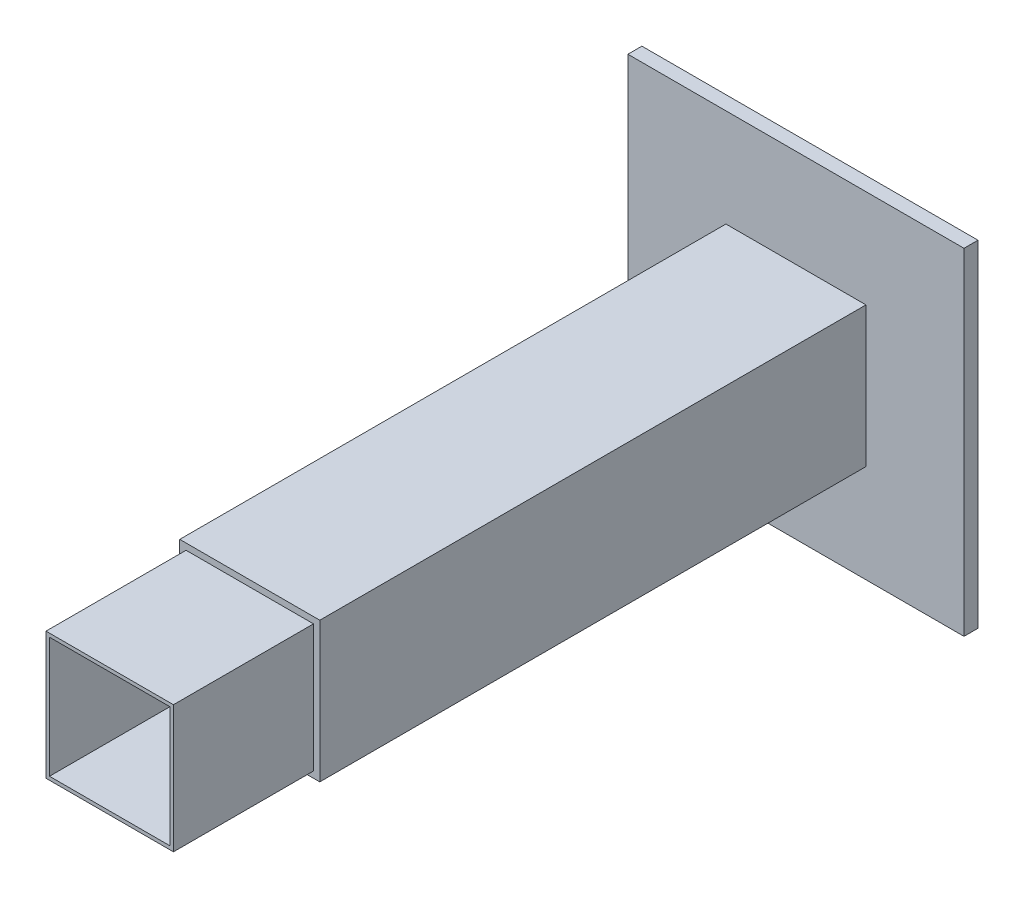
ISO-10303-21;
HEADER;
FILE_DESCRIPTION(('STEP AP214'),'2;1');
FILE_NAME('part.step','',(''),(''),'','','');
FILE_SCHEMA(('AUTOMOTIVE_DESIGN { 1 0 10303 214 1 1 1 1 }'));
ENDSEC;
DATA;
#1=APPLICATION_CONTEXT('core data for automotive mechanical design processes');
#2=APPLICATION_PROTOCOL_DEFINITION('international standard','automotive_design',2000,#1);
#3=PRODUCT_CONTEXT('',#1,'mechanical');
#4=PRODUCT('Part','Part','',(#3));
#5=PRODUCT_RELATED_PRODUCT_CATEGORY('part','',(#4));
#6=PRODUCT_DEFINITION_FORMATION('','',#4);
#7=PRODUCT_DEFINITION_CONTEXT('part definition',#1,'design');
#8=PRODUCT_DEFINITION('design','',#6,#7);
#9=PRODUCT_DEFINITION_SHAPE('','',#8);
#10=(LENGTH_UNIT() NAMED_UNIT(*) SI_UNIT(.MILLI.,.METRE.));
#11=(NAMED_UNIT(*) PLANE_ANGLE_UNIT() SI_UNIT($,.RADIAN.));
#12=(NAMED_UNIT(*) SI_UNIT($,.STERADIAN.) SOLID_ANGLE_UNIT());
#13=UNCERTAINTY_MEASURE_WITH_UNIT(LENGTH_MEASURE(1.E-05),#10,'distance_accuracy_value','');
#14=(GEOMETRIC_REPRESENTATION_CONTEXT(3) GLOBAL_UNCERTAINTY_ASSIGNED_CONTEXT((#13)) GLOBAL_UNIT_ASSIGNED_CONTEXT((#10,
#11,#12)) REPRESENTATION_CONTEXT('',''));
#15=CARTESIAN_POINT('',(0.,0.,0.));
#16=DIRECTION('',(0.,0.,1.));
#17=DIRECTION('',(1.,0.,0.));
#18=AXIS2_PLACEMENT_3D('',#15,#16,#17);
#19=CARTESIAN_POINT('',(0.,0.,250.));
#20=DIRECTION('',(0.,0.,1.));
#21=DIRECTION('',(1.,0.,0.));
#22=AXIS2_PLACEMENT_3D('',#19,#20,#21);
#23=PLANE('',#22);
#24=DIRECTION('',(-1.,0.,0.));
#25=VECTOR('',#24,1.);
#26=CARTESIAN_POINT('',(0.,-22.75,250.));
#27=LINE('',#26,#25);
#28=CARTESIAN_POINT('',(22.75,-22.75,250.));
#29=VERTEX_POINT('',#28);
#30=CARTESIAN_POINT('',(-22.75,-22.75,250.));
#31=VERTEX_POINT('',#30);
#32=EDGE_CURVE('E61',#29,#31,#27,.T.);
#33=ORIENTED_EDGE('',*,*,#32,.F.);
#34=DIRECTION('',(0.,1.,0.));
#35=VECTOR('',#34,1.);
#36=CARTESIAN_POINT('',(22.75,0.,250.));
#37=LINE('',#36,#35);
#38=CARTESIAN_POINT('',(22.75,22.75,250.));
#39=VERTEX_POINT('',#38);
#40=EDGE_CURVE('E180',#29,#39,#37,.T.);
#41=ORIENTED_EDGE('',*,*,#40,.T.);
#42=DIRECTION('',(-1.,0.,0.));
#43=VECTOR('',#42,1.);
#44=CARTESIAN_POINT('',(0.,22.75,250.));
#45=LINE('',#44,#43);
#46=CARTESIAN_POINT('',(-22.75,22.75,250.));
#47=VERTEX_POINT('',#46);
#48=EDGE_CURVE('E184',#39,#47,#45,.T.);
#49=ORIENTED_EDGE('',*,*,#48,.T.);
#50=DIRECTION('',(0.,1.,0.));
#51=VECTOR('',#50,1.);
#52=CARTESIAN_POINT('',(-22.75,0.,250.));
#53=LINE('',#52,#51);
#54=EDGE_CURVE('E200',#31,#47,#53,.T.);
#55=ORIENTED_EDGE('',*,*,#54,.F.);
#56=EDGE_LOOP('',(#33,#41,#49,#55));
#57=FACE_BOUND('',#56,.T.);
#58=DIRECTION('',(-1.,0.,0.));
#59=VECTOR('',#58,1.);
#60=CARTESIAN_POINT('',(21.5,-21.5,250.));
#61=LINE('',#60,#59);
#62=CARTESIAN_POINT('',(21.5,-21.5,250.));
#63=VERTEX_POINT('',#62);
#64=CARTESIAN_POINT('',(-21.5,-21.5,250.));
#65=VERTEX_POINT('',#64);
#66=EDGE_CURVE('E233',#63,#65,#61,.T.);
#67=ORIENTED_EDGE('',*,*,#66,.T.);
#68=DIRECTION('',(0.,1.,0.));
#69=VECTOR('',#68,1.);
#70=CARTESIAN_POINT('',(-21.5,-21.5,250.));
#71=LINE('',#70,#69);
#72=CARTESIAN_POINT('',(-21.5,21.5,250.));
#73=VERTEX_POINT('',#72);
#74=EDGE_CURVE('E229',#65,#73,#71,.T.);
#75=ORIENTED_EDGE('',*,*,#74,.T.);
#76=DIRECTION('',(-1.,0.,0.));
#77=VECTOR('',#76,1.);
#78=CARTESIAN_POINT('',(21.5,21.5,250.));
#79=LINE('',#78,#77);
#80=CARTESIAN_POINT('',(21.5,21.5,250.));
#81=VERTEX_POINT('',#80);
#82=EDGE_CURVE('E213',#81,#73,#79,.T.);
#83=ORIENTED_EDGE('',*,*,#82,.F.);
#84=DIRECTION('',(0.,1.,0.));
#85=VECTOR('',#84,1.);
#86=CARTESIAN_POINT('',(21.5,-21.5,250.));
#87=LINE('',#86,#85);
#88=EDGE_CURVE('E237',#63,#81,#87,.T.);
#89=ORIENTED_EDGE('',*,*,#88,.F.);
#90=EDGE_LOOP('',(#67,#75,#83,#89));
#91=FACE_BOUND('',#90,.T.);
#92=ADVANCED_FACE('F45',(#57,#91),#23,.T.);
#93=CARTESIAN_POINT('',(25.,25.,250.));
#94=DIRECTION('',(-1.,0.,0.));
#95=DIRECTION('',(0.,-1.,0.));
#96=AXIS2_PLACEMENT_3D('',#93,#94,#95);
#97=PLANE('',#96);
#98=DIRECTION('',(0.,1.,0.));
#99=VECTOR('',#98,1.);
#100=CARTESIAN_POINT('',(25.,-25.,200.));
#101=LINE('',#100,#99);
#102=CARTESIAN_POINT('',(25.,-25.,200.));
#103=VERTEX_POINT('',#102);
#104=CARTESIAN_POINT('',(25.,25.,200.));
#105=VERTEX_POINT('',#104);
#106=EDGE_CURVE('E202',#103,#105,#101,.T.);
#107=ORIENTED_EDGE('',*,*,#106,.F.);
#108=DIRECTION('',(0.,0.,-1.));
#109=VECTOR('',#108,1.);
#110=CARTESIAN_POINT('',(25.,-25.,250.));
#111=LINE('',#110,#109);
#112=CARTESIAN_POINT('',(25.,-25.,5.));
#113=VERTEX_POINT('',#112);
#114=EDGE_CURVE('E271',#103,#113,#111,.T.);
#115=ORIENTED_EDGE('',*,*,#114,.T.);
#116=DIRECTION('',(0.,1.,0.));
#117=VECTOR('',#116,1.);
#118=CARTESIAN_POINT('',(25.,25.,5.));
#119=LINE('',#118,#117);
#120=CARTESIAN_POINT('',(25.,25.,5.));
#121=VERTEX_POINT('',#120);
#122=EDGE_CURVE('E225',#113,#121,#119,.T.);
#123=ORIENTED_EDGE('',*,*,#122,.T.);
#124=DIRECTION('',(0.,0.,-1.));
#125=VECTOR('',#124,1.);
#126=CARTESIAN_POINT('',(25.,25.,250.));
#127=LINE('',#126,#125);
#128=EDGE_CURVE('E280',#105,#121,#127,.T.);
#129=ORIENTED_EDGE('',*,*,#128,.F.);
#130=EDGE_LOOP('',(#107,#115,#123,#129));
#131=FACE_BOUND('',#130,.T.);
#132=ADVANCED_FACE('F347',(#131),#97,.F.);
#133=CARTESIAN_POINT('',(-25.,25.,250.));
#134=DIRECTION('',(0.,-1.,0.));
#135=DIRECTION('',(0.,0.,-1.));
#136=AXIS2_PLACEMENT_3D('',#133,#134,#135);
#137=PLANE('',#136);
#138=DIRECTION('',(-1.,0.,0.));
#139=VECTOR('',#138,1.);
#140=CARTESIAN_POINT('',(25.,25.,200.));
#141=LINE('',#140,#139);
#142=CARTESIAN_POINT('',(-25.,25.,200.));
#143=VERTEX_POINT('',#142);
#144=EDGE_CURVE('E205',#105,#143,#141,.T.);
#145=ORIENTED_EDGE('',*,*,#144,.F.);
#146=ORIENTED_EDGE('',*,*,#128,.T.);
#147=DIRECTION('',(-1.,0.,0.));
#148=VECTOR('',#147,1.);
#149=CARTESIAN_POINT('',(-25.,25.,5.));
#150=LINE('',#149,#148);
#151=CARTESIAN_POINT('',(-25.,25.,5.));
#152=VERTEX_POINT('',#151);
#153=EDGE_CURVE('E259',#121,#152,#150,.T.);
#154=ORIENTED_EDGE('',*,*,#153,.T.);
#155=DIRECTION('',(0.,0.,-1.));
#156=VECTOR('',#155,1.);
#157=CARTESIAN_POINT('',(-25.,25.,250.));
#158=LINE('',#157,#156);
#159=EDGE_CURVE('E277',#143,#152,#158,.T.);
#160=ORIENTED_EDGE('',*,*,#159,.F.);
#161=EDGE_LOOP('',(#145,#146,#154,#160));
#162=FACE_BOUND('',#161,.T.);
#163=ADVANCED_FACE('F355',(#162),#137,.F.);
#164=CARTESIAN_POINT('',(-25.,25.,250.));
#165=DIRECTION('',(1.,0.,0.));
#166=DIRECTION('',(0.,1.,0.));
#167=AXIS2_PLACEMENT_3D('',#164,#165,#166);
#168=PLANE('',#167);
#169=DIRECTION('',(0.,-1.,0.));
#170=VECTOR('',#169,1.);
#171=CARTESIAN_POINT('',(-25.,25.,200.));
#172=LINE('',#171,#170);
#173=CARTESIAN_POINT('',(-25.,-25.,200.));
#174=VERTEX_POINT('',#173);
#175=EDGE_CURVE('E69',#143,#174,#172,.T.);
#176=ORIENTED_EDGE('',*,*,#175,.F.);
#177=ORIENTED_EDGE('',*,*,#159,.T.);
#178=DIRECTION('',(0.,-1.,0.));
#179=VECTOR('',#178,1.);
#180=CARTESIAN_POINT('',(-25.,25.,5.));
#181=LINE('',#180,#179);
#182=CARTESIAN_POINT('',(-25.,-25.,5.));
#183=VERTEX_POINT('',#182);
#184=EDGE_CURVE('E263',#152,#183,#181,.T.);
#185=ORIENTED_EDGE('',*,*,#184,.T.);
#186=DIRECTION('',(0.,0.,-1.));
#187=VECTOR('',#186,1.);
#188=CARTESIAN_POINT('',(-25.,-25.,250.));
#189=LINE('',#188,#187);
#190=EDGE_CURVE('E274',#174,#183,#189,.T.);
#191=ORIENTED_EDGE('',*,*,#190,.F.);
#192=EDGE_LOOP('',(#176,#177,#185,#191));
#193=FACE_BOUND('',#192,.T.);
#194=ADVANCED_FACE('F365',(#193),#168,.F.);
#195=CARTESIAN_POINT('',(-25.,-25.,250.));
#196=DIRECTION('',(0.,1.,0.));
#197=DIRECTION('',(0.,0.,1.));
#198=AXIS2_PLACEMENT_3D('',#195,#196,#197);
#199=PLANE('',#198);
#200=DIRECTION('',(1.,0.,0.));
#201=VECTOR('',#200,1.);
#202=CARTESIAN_POINT('',(-25.,-25.,200.));
#203=LINE('',#202,#201);
#204=EDGE_CURVE('E210',#174,#103,#203,.T.);
#205=ORIENTED_EDGE('',*,*,#204,.F.);
#206=ORIENTED_EDGE('',*,*,#190,.T.);
#207=DIRECTION('',(1.,0.,0.));
#208=VECTOR('',#207,1.);
#209=CARTESIAN_POINT('',(-25.,-25.,5.));
#210=LINE('',#209,#208);
#211=EDGE_CURVE('E267',#183,#113,#210,.T.);
#212=ORIENTED_EDGE('',*,*,#211,.T.);
#213=ORIENTED_EDGE('',*,*,#114,.F.);
#214=EDGE_LOOP('',(#205,#206,#212,#213));
#215=FACE_BOUND('',#214,.T.);
#216=ADVANCED_FACE('F363',(#215),#199,.F.);
#217=CARTESIAN_POINT('',(0.,0.,0.));
#218=DIRECTION('',(0.,0.,1.));
#219=DIRECTION('',(1.,0.,0.));
#220=AXIS2_PLACEMENT_3D('',#217,#218,#219);
#221=PLANE('',#220);
#222=DIRECTION('',(0.,-1.,0.));
#223=VECTOR('',#222,1.);
#224=CARTESIAN_POINT('',(-60.,-60.,0.));
#225=LINE('',#224,#223);
#226=CARTESIAN_POINT('',(-60.,60.,0.));
#227=VERTEX_POINT('',#226);
#228=CARTESIAN_POINT('',(-60.,-60.,0.));
#229=VERTEX_POINT('',#228);
#230=EDGE_CURVE('E283',#227,#229,#225,.T.);
#231=ORIENTED_EDGE('',*,*,#230,.F.);
#232=DIRECTION('',(-1.,0.,0.));
#233=VECTOR('',#232,1.);
#234=CARTESIAN_POINT('',(60.,60.,0.));
#235=LINE('',#234,#233);
#236=CARTESIAN_POINT('',(60.,60.,0.));
#237=VERTEX_POINT('',#236);
#238=EDGE_CURVE('E289',#237,#227,#235,.T.);
#239=ORIENTED_EDGE('',*,*,#238,.F.);
#240=DIRECTION('',(0.,1.,0.));
#241=VECTOR('',#240,1.);
#242=CARTESIAN_POINT('',(60.,-60.,0.));
#243=LINE('',#242,#241);
#244=CARTESIAN_POINT('',(60.,-60.,0.));
#245=VERTEX_POINT('',#244);
#246=EDGE_CURVE('E305',#245,#237,#243,.T.);
#247=ORIENTED_EDGE('',*,*,#246,.F.);
#248=DIRECTION('',(1.,0.,0.));
#249=VECTOR('',#248,1.);
#250=CARTESIAN_POINT('',(60.,-60.,0.));
#251=LINE('',#250,#249);
#252=EDGE_CURVE('E302',#229,#245,#251,.T.);
#253=ORIENTED_EDGE('',*,*,#252,.F.);
#254=EDGE_LOOP('',(#231,#239,#247,#253));
#255=FACE_BOUND('',#254,.T.);
#256=DIRECTION('',(0.,-1.,0.));
#257=VECTOR('',#256,1.);
#258=CARTESIAN_POINT('',(-21.5,-21.5,0.));
#259=LINE('',#258,#257);
#260=CARTESIAN_POINT('',(-21.5,21.5,0.));
#261=VERTEX_POINT('',#260);
#262=CARTESIAN_POINT('',(-21.5,-21.5,0.));
#263=VERTEX_POINT('',#262);
#264=EDGE_CURVE('E219',#261,#263,#259,.T.);
#265=ORIENTED_EDGE('',*,*,#264,.T.);
#266=DIRECTION('',(1.,0.,0.));
#267=VECTOR('',#266,1.);
#268=CARTESIAN_POINT('',(21.5,-21.5,0.));
#269=LINE('',#268,#267);
#270=CARTESIAN_POINT('',(21.5,-21.5,0.));
#271=VERTEX_POINT('',#270);
#272=EDGE_CURVE('E214',#263,#271,#269,.T.);
#273=ORIENTED_EDGE('',*,*,#272,.T.);
#274=DIRECTION('',(0.,-1.,0.));
#275=VECTOR('',#274,1.);
#276=CARTESIAN_POINT('',(21.5,-21.5,0.));
#277=LINE('',#276,#275);
#278=CARTESIAN_POINT('',(21.5,21.5,0.));
#279=VERTEX_POINT('',#278);
#280=EDGE_CURVE('E218',#279,#271,#277,.T.);
#281=ORIENTED_EDGE('',*,*,#280,.F.);
#282=DIRECTION('',(1.,0.,0.));
#283=VECTOR('',#282,1.);
#284=CARTESIAN_POINT('',(21.5,21.5,0.));
#285=LINE('',#284,#283);
#286=EDGE_CURVE('E222',#261,#279,#285,.T.);
#287=ORIENTED_EDGE('',*,*,#286,.F.);
#288=EDGE_LOOP('',(#265,#273,#281,#287));
#289=FACE_BOUND('',#288,.T.);
#290=ADVANCED_FACE('F328',(#255,#289),#221,.F.);
#291=CARTESIAN_POINT('',(-60.,-60.,5.));
#292=DIRECTION('',(1.,0.,0.));
#293=DIRECTION('',(0.,0.,-1.));
#294=AXIS2_PLACEMENT_3D('',#291,#292,#293);
#295=PLANE('',#294);
#296=ORIENTED_EDGE('',*,*,#230,.T.);
#297=DIRECTION('',(0.,0.,-1.));
#298=VECTOR('',#297,1.);
#299=CARTESIAN_POINT('',(-60.,-60.,5.));
#300=LINE('',#299,#298);
#301=CARTESIAN_POINT('',(-60.,-60.,5.));
#302=VERTEX_POINT('',#301);
#303=EDGE_CURVE('E11',#302,#229,#300,.T.);
#304=ORIENTED_EDGE('',*,*,#303,.F.);
#305=DIRECTION('',(0.,-1.,0.));
#306=VECTOR('',#305,1.);
#307=CARTESIAN_POINT('',(-60.,-60.,5.));
#308=LINE('',#307,#306);
#309=CARTESIAN_POINT('',(-60.,60.,5.));
#310=VERTEX_POINT('',#309);
#311=EDGE_CURVE('E284',#310,#302,#308,.T.);
#312=ORIENTED_EDGE('',*,*,#311,.F.);
#313=DIRECTION('',(0.,0.,-1.));
#314=VECTOR('',#313,1.);
#315=CARTESIAN_POINT('',(-60.,60.,5.));
#316=LINE('',#315,#314);
#317=EDGE_CURVE('E298',#310,#227,#316,.T.);
#318=ORIENTED_EDGE('',*,*,#317,.T.);
#319=EDGE_LOOP('',(#296,#304,#312,#318));
#320=FACE_BOUND('',#319,.T.);
#321=ADVANCED_FACE('F47',(#320),#295,.F.);
#322=CARTESIAN_POINT('',(60.,-60.,5.));
#323=DIRECTION('',(0.,1.,0.));
#324=DIRECTION('',(-1.,0.,0.));
#325=AXIS2_PLACEMENT_3D('',#322,#323,#324);
#326=PLANE('',#325);
#327=ORIENTED_EDGE('',*,*,#252,.T.);
#328=DIRECTION('',(0.,0.,-1.));
#329=VECTOR('',#328,1.);
#330=CARTESIAN_POINT('',(60.,-60.,5.));
#331=LINE('',#330,#329);
#332=CARTESIAN_POINT('',(60.,-60.,5.));
#333=VERTEX_POINT('',#332);
#334=EDGE_CURVE('E54',#333,#245,#331,.T.);
#335=ORIENTED_EDGE('',*,*,#334,.F.);
#336=DIRECTION('',(1.,0.,0.));
#337=VECTOR('',#336,1.);
#338=CARTESIAN_POINT('',(60.,-60.,5.));
#339=LINE('',#338,#337);
#340=EDGE_CURVE('E288',#302,#333,#339,.T.);
#341=ORIENTED_EDGE('',*,*,#340,.F.);
#342=ORIENTED_EDGE('',*,*,#303,.T.);
#343=EDGE_LOOP('',(#327,#335,#341,#342));
#344=FACE_BOUND('',#343,.T.);
#345=ADVANCED_FACE('F339',(#344),#326,.F.);
#346=CARTESIAN_POINT('',(60.,-60.,5.));
#347=DIRECTION('',(-1.,0.,0.));
#348=DIRECTION('',(0.,0.,1.));
#349=AXIS2_PLACEMENT_3D('',#346,#347,#348);
#350=PLANE('',#349);
#351=ORIENTED_EDGE('',*,*,#246,.T.);
#352=DIRECTION('',(0.,0.,-1.));
#353=VECTOR('',#352,1.);
#354=CARTESIAN_POINT('',(60.,60.,5.));
#355=LINE('',#354,#353);
#356=CARTESIAN_POINT('',(60.,60.,5.));
#357=VERTEX_POINT('',#356);
#358=EDGE_CURVE('E313',#357,#237,#355,.T.);
#359=ORIENTED_EDGE('',*,*,#358,.F.);
#360=DIRECTION('',(0.,1.,0.));
#361=VECTOR('',#360,1.);
#362=CARTESIAN_POINT('',(60.,-60.,5.));
#363=LINE('',#362,#361);
#364=EDGE_CURVE('E292',#333,#357,#363,.T.);
#365=ORIENTED_EDGE('',*,*,#364,.F.);
#366=ORIENTED_EDGE('',*,*,#334,.T.);
#367=EDGE_LOOP('',(#351,#359,#365,#366));
#368=FACE_BOUND('',#367,.T.);
#369=ADVANCED_FACE('F322',(#368),#350,.F.);
#370=CARTESIAN_POINT('',(60.,60.,5.));
#371=DIRECTION('',(0.,-1.,0.));
#372=DIRECTION('',(1.,0.,0.));
#373=AXIS2_PLACEMENT_3D('',#370,#371,#372);
#374=PLANE('',#373);
#375=ORIENTED_EDGE('',*,*,#238,.T.);
#376=ORIENTED_EDGE('',*,*,#317,.F.);
#377=DIRECTION('',(-1.,0.,0.));
#378=VECTOR('',#377,1.);
#379=CARTESIAN_POINT('',(60.,60.,5.));
#380=LINE('',#379,#378);
#381=EDGE_CURVE('E295',#357,#310,#380,.T.);
#382=ORIENTED_EDGE('',*,*,#381,.F.);
#383=ORIENTED_EDGE('',*,*,#358,.T.);
#384=EDGE_LOOP('',(#375,#376,#382,#383));
#385=FACE_BOUND('',#384,.T.);
#386=ADVANCED_FACE('F332',(#385),#374,.F.);
#387=CARTESIAN_POINT('',(0.,0.,5.));
#388=DIRECTION('',(0.,0.,1.));
#389=DIRECTION('',(1.,0.,0.));
#390=AXIS2_PLACEMENT_3D('',#387,#388,#389);
#391=PLANE('',#390);
#392=ORIENTED_EDGE('',*,*,#122,.F.);
#393=ORIENTED_EDGE('',*,*,#211,.F.);
#394=ORIENTED_EDGE('',*,*,#184,.F.);
#395=ORIENTED_EDGE('',*,*,#153,.F.);
#396=EDGE_LOOP('',(#392,#393,#394,#395));
#397=FACE_BOUND('',#396,.T.);
#398=ORIENTED_EDGE('',*,*,#311,.T.);
#399=ORIENTED_EDGE('',*,*,#340,.T.);
#400=ORIENTED_EDGE('',*,*,#364,.T.);
#401=ORIENTED_EDGE('',*,*,#381,.T.);
#402=EDGE_LOOP('',(#398,#399,#400,#401));
#403=FACE_BOUND('',#402,.T.);
#404=ADVANCED_FACE('F338',(#397,#403),#391,.T.);
#405=CARTESIAN_POINT('',(-21.5,-21.5,-60.811183182043));
#406=DIRECTION('',(1.,0.,0.));
#407=DIRECTION('',(0.,0.,-1.));
#408=AXIS2_PLACEMENT_3D('',#405,#406,#407);
#409=PLANE('',#408);
#410=DIRECTION('',(0.,0.,1.));
#411=VECTOR('',#410,1.);
#412=CARTESIAN_POINT('',(-21.5,21.5,-60.811183182043));
#413=LINE('',#412,#411);
#414=EDGE_CURVE('E240',#261,#73,#413,.T.);
#415=ORIENTED_EDGE('',*,*,#414,.T.);
#416=ORIENTED_EDGE('',*,*,#74,.F.);
#417=DIRECTION('',(0.,0.,1.));
#418=VECTOR('',#417,1.);
#419=CARTESIAN_POINT('',(-21.5,-21.5,-60.811183182043));
#420=LINE('',#419,#418);
#421=EDGE_CURVE('E248',#263,#65,#420,.T.);
#422=ORIENTED_EDGE('',*,*,#421,.F.);
#423=ORIENTED_EDGE('',*,*,#264,.F.);
#424=EDGE_LOOP('',(#415,#416,#422,#423));
#425=FACE_BOUND('',#424,.T.);
#426=ADVANCED_FACE('F375',(#425),#409,.T.);
#427=CARTESIAN_POINT('',(21.5,-21.5,-60.811183182043));
#428=DIRECTION('',(0.,1.,0.));
#429=DIRECTION('',(0.,0.,1.));
#430=AXIS2_PLACEMENT_3D('',#427,#428,#429);
#431=PLANE('',#430);
#432=ORIENTED_EDGE('',*,*,#421,.T.);
#433=ORIENTED_EDGE('',*,*,#66,.F.);
#434=DIRECTION('',(0.,0.,1.));
#435=VECTOR('',#434,1.);
#436=CARTESIAN_POINT('',(21.5,-21.5,-60.811183182043));
#437=LINE('',#436,#435);
#438=EDGE_CURVE('E245',#271,#63,#437,.T.);
#439=ORIENTED_EDGE('',*,*,#438,.F.);
#440=ORIENTED_EDGE('',*,*,#272,.F.);
#441=EDGE_LOOP('',(#432,#433,#439,#440));
#442=FACE_BOUND('',#441,.T.);
#443=ADVANCED_FACE('F401',(#442),#431,.T.);
#444=CARTESIAN_POINT('',(21.5,-21.5,-60.811183182043));
#445=DIRECTION('',(1.,0.,0.));
#446=DIRECTION('',(0.,0.,-1.));
#447=AXIS2_PLACEMENT_3D('',#444,#445,#446);
#448=PLANE('',#447);
#449=ORIENTED_EDGE('',*,*,#280,.T.);
#450=ORIENTED_EDGE('',*,*,#438,.T.);
#451=ORIENTED_EDGE('',*,*,#88,.T.);
#452=DIRECTION('',(0.,0.,1.));
#453=VECTOR('',#452,1.);
#454=CARTESIAN_POINT('',(21.5,21.5,-60.811183182043));
#455=LINE('',#454,#453);
#456=EDGE_CURVE('E241',#279,#81,#455,.T.);
#457=ORIENTED_EDGE('',*,*,#456,.F.);
#458=EDGE_LOOP('',(#449,#450,#451,#457));
#459=FACE_BOUND('',#458,.T.);
#460=ADVANCED_FACE('F408',(#459),#448,.F.);
#461=CARTESIAN_POINT('',(21.5,21.5,-60.811183182043));
#462=DIRECTION('',(0.,1.,0.));
#463=DIRECTION('',(0.,0.,1.));
#464=AXIS2_PLACEMENT_3D('',#461,#462,#463);
#465=PLANE('',#464);
#466=ORIENTED_EDGE('',*,*,#286,.T.);
#467=ORIENTED_EDGE('',*,*,#456,.T.);
#468=ORIENTED_EDGE('',*,*,#82,.T.);
#469=ORIENTED_EDGE('',*,*,#414,.F.);
#470=EDGE_LOOP('',(#466,#467,#468,#469));
#471=FACE_BOUND('',#470,.T.);
#472=ADVANCED_FACE('F361',(#471),#465,.F.);
#473=CARTESIAN_POINT('',(0.,0.,200.));
#474=DIRECTION('',(0.,0.,1.));
#475=DIRECTION('',(1.,0.,0.));
#476=AXIS2_PLACEMENT_3D('',#473,#474,#475);
#477=PLANE('',#476);
#478=ORIENTED_EDGE('',*,*,#106,.T.);
#479=ORIENTED_EDGE('',*,*,#144,.T.);
#480=ORIENTED_EDGE('',*,*,#175,.T.);
#481=ORIENTED_EDGE('',*,*,#204,.T.);
#482=EDGE_LOOP('',(#478,#479,#480,#481));
#483=FACE_BOUND('',#482,.T.);
#484=DIRECTION('',(1.,0.,0.));
#485=VECTOR('',#484,1.);
#486=CARTESIAN_POINT('',(0.,-22.75,200.));
#487=LINE('',#486,#485);
#488=CARTESIAN_POINT('',(-22.75,-22.75,200.));
#489=VERTEX_POINT('',#488);
#490=CARTESIAN_POINT('',(22.75,-22.75,200.));
#491=VERTEX_POINT('',#490);
#492=EDGE_CURVE('E198',#489,#491,#487,.T.);
#493=ORIENTED_EDGE('',*,*,#492,.F.);
#494=DIRECTION('',(0.,-1.,0.));
#495=VECTOR('',#494,1.);
#496=CARTESIAN_POINT('',(-22.75,0.,200.));
#497=LINE('',#496,#495);
#498=CARTESIAN_POINT('',(-22.75,22.75,200.));
#499=VERTEX_POINT('',#498);
#500=EDGE_CURVE('E176',#499,#489,#497,.T.);
#501=ORIENTED_EDGE('',*,*,#500,.F.);
#502=DIRECTION('',(1.,0.,0.));
#503=VECTOR('',#502,1.);
#504=CARTESIAN_POINT('',(0.,22.75,200.));
#505=LINE('',#504,#503);
#506=CARTESIAN_POINT('',(22.75,22.75,200.));
#507=VERTEX_POINT('',#506);
#508=EDGE_CURVE('E174',#499,#507,#505,.T.);
#509=ORIENTED_EDGE('',*,*,#508,.T.);
#510=DIRECTION('',(0.,-1.,0.));
#511=VECTOR('',#510,1.);
#512=CARTESIAN_POINT('',(22.75,0.,200.));
#513=LINE('',#512,#511);
#514=EDGE_CURVE('E160',#507,#491,#513,.T.);
#515=ORIENTED_EDGE('',*,*,#514,.T.);
#516=EDGE_LOOP('',(#493,#501,#509,#515));
#517=FACE_BOUND('',#516,.T.);
#518=ADVANCED_FACE('F175',(#483,#517),#477,.T.);
#519=CARTESIAN_POINT('',(0.,-22.75,133.531962568465));
#520=DIRECTION('',(0.,1.,0.));
#521=DIRECTION('',(-1.,0.,0.));
#522=AXIS2_PLACEMENT_3D('',#519,#520,#521);
#523=PLANE('',#522);
#524=ORIENTED_EDGE('',*,*,#492,.T.);
#525=DIRECTION('',(0.,0.,1.));
#526=VECTOR('',#525,1.);
#527=CARTESIAN_POINT('',(22.75,-22.75,133.531962568465));
#528=LINE('',#527,#526);
#529=EDGE_CURVE('E167',#491,#29,#528,.T.);
#530=ORIENTED_EDGE('',*,*,#529,.T.);
#531=ORIENTED_EDGE('',*,*,#32,.T.);
#532=DIRECTION('',(0.,0.,1.));
#533=VECTOR('',#532,1.);
#534=CARTESIAN_POINT('',(-22.75,-22.75,133.531962568465));
#535=LINE('',#534,#533);
#536=EDGE_CURVE('E171',#489,#31,#535,.T.);
#537=ORIENTED_EDGE('',*,*,#536,.F.);
#538=EDGE_LOOP('',(#524,#530,#531,#537));
#539=FACE_BOUND('',#538,.T.);
#540=ADVANCED_FACE('F465',(#539),#523,.F.);
#541=CARTESIAN_POINT('',(22.75,0.,133.531962568465));
#542=DIRECTION('',(1.,0.,0.));
#543=DIRECTION('',(0.,0.,-1.));
#544=AXIS2_PLACEMENT_3D('',#541,#542,#543);
#545=PLANE('',#544);
#546=DIRECTION('',(0.,0.,1.));
#547=VECTOR('',#546,1.);
#548=CARTESIAN_POINT('',(22.75,22.75,133.531962568465));
#549=LINE('',#548,#547);
#550=EDGE_CURVE('E165',#507,#39,#549,.T.);
#551=ORIENTED_EDGE('',*,*,#550,.T.);
#552=ORIENTED_EDGE('',*,*,#40,.F.);
#553=ORIENTED_EDGE('',*,*,#529,.F.);
#554=ORIENTED_EDGE('',*,*,#514,.F.);
#555=EDGE_LOOP('',(#551,#552,#553,#554));
#556=FACE_BOUND('',#555,.T.);
#557=ADVANCED_FACE('F162',(#556),#545,.T.);
#558=CARTESIAN_POINT('',(0.,22.75,133.531962568465));
#559=DIRECTION('',(0.,1.,0.));
#560=DIRECTION('',(-1.,0.,0.));
#561=AXIS2_PLACEMENT_3D('',#558,#559,#560);
#562=PLANE('',#561);
#563=DIRECTION('',(0.,0.,1.));
#564=VECTOR('',#563,1.);
#565=CARTESIAN_POINT('',(-22.75,22.75,133.531962568465));
#566=LINE('',#565,#564);
#567=EDGE_CURVE('E189',#499,#47,#566,.T.);
#568=ORIENTED_EDGE('',*,*,#567,.T.);
#569=ORIENTED_EDGE('',*,*,#48,.F.);
#570=ORIENTED_EDGE('',*,*,#550,.F.);
#571=ORIENTED_EDGE('',*,*,#508,.F.);
#572=EDGE_LOOP('',(#568,#569,#570,#571));
#573=FACE_BOUND('',#572,.T.);
#574=ADVANCED_FACE('F182',(#573),#562,.T.);
#575=CARTESIAN_POINT('',(-22.75,0.,133.531962568465));
#576=DIRECTION('',(1.,0.,0.));
#577=DIRECTION('',(0.,0.,-1.));
#578=AXIS2_PLACEMENT_3D('',#575,#576,#577);
#579=PLANE('',#578);
#580=ORIENTED_EDGE('',*,*,#500,.T.);
#581=ORIENTED_EDGE('',*,*,#536,.T.);
#582=ORIENTED_EDGE('',*,*,#54,.T.);
#583=ORIENTED_EDGE('',*,*,#567,.F.);
#584=EDGE_LOOP('',(#580,#581,#582,#583));
#585=FACE_BOUND('',#584,.T.);
#586=ADVANCED_FACE('F493',(#585),#579,.F.);
#587=CLOSED_SHELL('',(#92,#132,#163,#194,#216,#290,#321,#345,#369,#386,#404,#426,#443,#460,#472,
#518,#540,#557,#574,#586));
#588=MANIFOLD_SOLID_BREP('B2',#587);
#589=ADVANCED_BREP_SHAPE_REPRESENTATION('',(#18,#588),#14);
#590=SHAPE_DEFINITION_REPRESENTATION(#9,#589);
ENDSEC;
END-ISO-10303-21;
